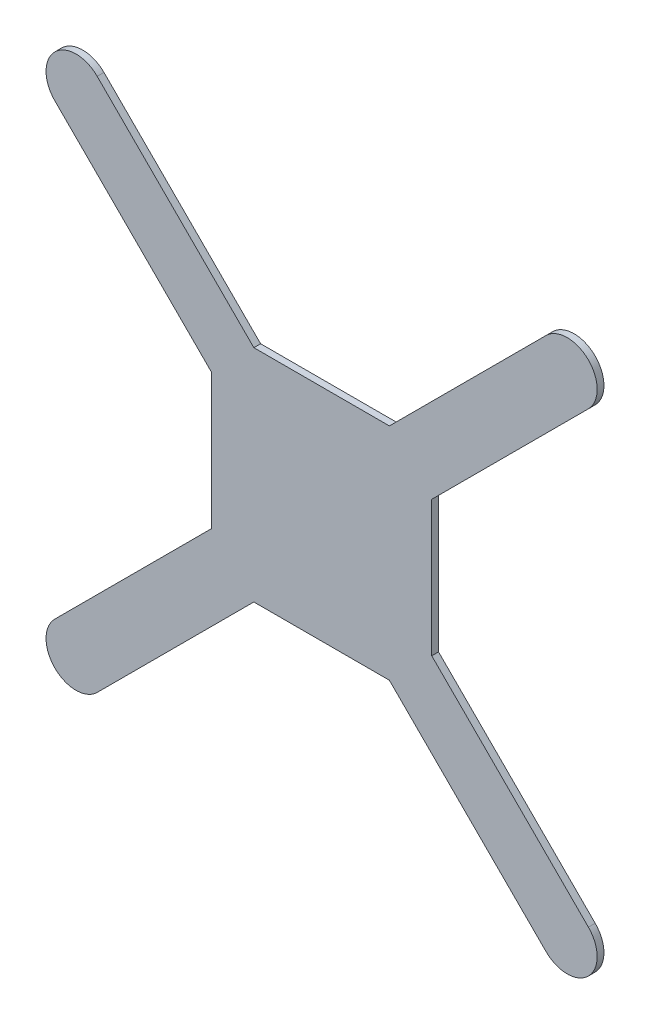
ISO-10303-21;
HEADER;
FILE_DESCRIPTION(('STEP AP214'),'2;1');
FILE_NAME('part.step','',(''),(''),'','','');
FILE_SCHEMA(('AUTOMOTIVE_DESIGN { 1 0 10303 214 1 1 1 1 }'));
ENDSEC;
DATA;
#1=APPLICATION_CONTEXT('core data for automotive mechanical design processes');
#2=APPLICATION_PROTOCOL_DEFINITION('international standard','automotive_design',2000,#1);
#3=PRODUCT_CONTEXT('',#1,'mechanical');
#4=PRODUCT('Part','Part','',(#3));
#5=PRODUCT_RELATED_PRODUCT_CATEGORY('part','',(#4));
#6=PRODUCT_DEFINITION_FORMATION('','',#4);
#7=PRODUCT_DEFINITION_CONTEXT('part definition',#1,'design');
#8=PRODUCT_DEFINITION('design','',#6,#7);
#9=PRODUCT_DEFINITION_SHAPE('','',#8);
#10=(LENGTH_UNIT() NAMED_UNIT(*) SI_UNIT(.MILLI.,.METRE.));
#11=(NAMED_UNIT(*) PLANE_ANGLE_UNIT() SI_UNIT($,.RADIAN.));
#12=(NAMED_UNIT(*) SI_UNIT($,.STERADIAN.) SOLID_ANGLE_UNIT());
#13=UNCERTAINTY_MEASURE_WITH_UNIT(LENGTH_MEASURE(1.E-05),#10,'distance_accuracy_value','');
#14=(GEOMETRIC_REPRESENTATION_CONTEXT(3) GLOBAL_UNCERTAINTY_ASSIGNED_CONTEXT((#13)) GLOBAL_UNIT_ASSIGNED_CONTEXT((#10,
#11,#12)) REPRESENTATION_CONTEXT('',''));
#15=CARTESIAN_POINT('',(0.,0.,0.));
#16=DIRECTION('',(0.,0.,1.));
#17=DIRECTION('',(1.,0.,0.));
#18=AXIS2_PLACEMENT_3D('',#15,#16,#17);
#19=CARTESIAN_POINT('',(-144.956890143243,-144.956890143242,4.));
#20=DIRECTION('',(0.,0.,-1.));
#21=DIRECTION('',(-1.,0.,0.));
#22=AXIS2_PLACEMENT_3D('',#19,#20,#21);
#23=CYLINDRICAL_SURFACE('',#22,17.6776695296638);
#24=CARTESIAN_POINT('',(-144.956890143243,-144.956890143242,0.));
#25=DIRECTION('',(0.,0.,1.));
#26=DIRECTION('',(1.,0.,0.));
#27=AXIS2_PLACEMENT_3D('',#24,#25,#26);
#28=CIRCLE('',#27,17.6776695296638);
#29=CARTESIAN_POINT('',(-132.456890143243,-157.456890143242,0.));
#30=VERTEX_POINT('',#29);
#31=CARTESIAN_POINT('',(-157.456890143243,-132.456890143242,0.));
#32=VERTEX_POINT('',#31);
#33=EDGE_CURVE('E182',#30,#32,#28,.F.);
#34=ORIENTED_EDGE('',*,*,#33,.F.);
#35=DIRECTION('',(0.,0.,-1.));
#36=VECTOR('',#35,1.);
#37=CARTESIAN_POINT('',(-132.456890143243,-157.456890143242,4.));
#38=LINE('',#37,#36);
#39=CARTESIAN_POINT('',(-132.456890143243,-157.456890143242,4.));
#40=VERTEX_POINT('',#39);
#41=EDGE_CURVE('E11',#40,#30,#38,.T.);
#42=ORIENTED_EDGE('',*,*,#41,.F.);
#43=CARTESIAN_POINT('',(-144.956890143243,-144.956890143242,4.));
#44=DIRECTION('',(0.,0.,1.));
#45=DIRECTION('',(1.,0.,0.));
#46=AXIS2_PLACEMENT_3D('',#43,#44,#45);
#47=CIRCLE('',#46,17.6776695296638);
#48=CARTESIAN_POINT('',(-157.456890143243,-132.456890143242,4.));
#49=VERTEX_POINT('',#48);
#50=EDGE_CURVE('E222',#40,#49,#47,.F.);
#51=ORIENTED_EDGE('',*,*,#50,.T.);
#52=DIRECTION('',(0.,0.,-1.));
#53=VECTOR('',#52,1.);
#54=CARTESIAN_POINT('',(-157.456890143243,-132.456890143242,4.));
#55=LINE('',#54,#53);
#56=EDGE_CURVE('E115',#49,#32,#55,.T.);
#57=ORIENTED_EDGE('',*,*,#56,.T.);
#58=EDGE_LOOP('',(#34,#42,#51,#57));
#59=FACE_BOUND('',#58,.T.);
#60=ADVANCED_FACE('F41',(#59),#23,.T.);
#61=CARTESIAN_POINT('',(12.5000000000001,-12.5000000000002,4.));
#62=DIRECTION('',(0.707106781186545,-0.70710678118655,0.));
#63=DIRECTION('',(0.70710678118655,0.707106781186545,0.));
#64=AXIS2_PLACEMENT_3D('',#61,#62,#63);
#65=PLANE('',#64);
#66=DIRECTION('',(-0.70710678118655,-0.707106781186545,0.));
#67=VECTOR('',#66,1.);
#68=CARTESIAN_POINT('',(12.5000000000001,-12.5000000000002,0.));
#69=LINE('',#68,#67);
#70=CARTESIAN_POINT('',(-40.,-64.9999999999999,0.));
#71=VERTEX_POINT('',#70);
#72=EDGE_CURVE('E185',#71,#30,#69,.T.);
#73=ORIENTED_EDGE('',*,*,#72,.F.);
#74=DIRECTION('',(0.,0.,-1.));
#75=VECTOR('',#74,1.);
#76=CARTESIAN_POINT('',(-40.,-64.9999999999999,4.));
#77=LINE('',#76,#75);
#78=CARTESIAN_POINT('',(-40.,-64.9999999999999,4.));
#79=VERTEX_POINT('',#78);
#80=EDGE_CURVE('E49',#79,#71,#77,.T.);
#81=ORIENTED_EDGE('',*,*,#80,.F.);
#82=DIRECTION('',(-0.70710678118655,-0.707106781186545,0.));
#83=VECTOR('',#82,1.);
#84=CARTESIAN_POINT('',(12.5000000000001,-12.5000000000002,4.));
#85=LINE('',#84,#83);
#86=EDGE_CURVE('E263',#79,#40,#85,.T.);
#87=ORIENTED_EDGE('',*,*,#86,.T.);
#88=ORIENTED_EDGE('',*,*,#41,.T.);
#89=EDGE_LOOP('',(#73,#81,#87,#88));
#90=FACE_BOUND('',#89,.T.);
#91=ADVANCED_FACE('F262',(#90),#65,.T.);
#92=CARTESIAN_POINT('',(0.,-64.9999999999999,4.));
#93=DIRECTION('',(0.,1.,0.));
#94=DIRECTION('',(-1.,0.,0.));
#95=AXIS2_PLACEMENT_3D('',#92,#93,#94);
#96=PLANE('',#95);
#97=DIRECTION('',(1.,0.,0.));
#98=VECTOR('',#97,1.);
#99=CARTESIAN_POINT('',(0.,-64.9999999999999,0.));
#100=LINE('',#99,#98);
#101=CARTESIAN_POINT('',(39.9999999999999,-64.9999999999999,0.));
#102=VERTEX_POINT('',#101);
#103=EDGE_CURVE('E188',#71,#102,#100,.T.);
#104=ORIENTED_EDGE('',*,*,#103,.T.);
#105=DIRECTION('',(0.,0.,-1.));
#106=VECTOR('',#105,1.);
#107=CARTESIAN_POINT('',(39.9999999999999,-64.9999999999999,4.));
#108=LINE('',#107,#106);
#109=CARTESIAN_POINT('',(39.9999999999999,-64.9999999999999,4.));
#110=VERTEX_POINT('',#109);
#111=EDGE_CURVE('E246',#110,#102,#108,.T.);
#112=ORIENTED_EDGE('',*,*,#111,.F.);
#113=DIRECTION('',(1.,0.,0.));
#114=VECTOR('',#113,1.);
#115=CARTESIAN_POINT('',(0.,-64.9999999999999,4.));
#116=LINE('',#115,#114);
#117=EDGE_CURVE('E253',#79,#110,#116,.T.);
#118=ORIENTED_EDGE('',*,*,#117,.F.);
#119=ORIENTED_EDGE('',*,*,#80,.T.);
#120=EDGE_LOOP('',(#104,#112,#118,#119));
#121=FACE_BOUND('',#120,.T.);
#122=ADVANCED_FACE('F251',(#121),#96,.F.);
#123=CARTESIAN_POINT('',(-12.5000000000002,-12.5000000000003,4.));
#124=DIRECTION('',(0.707106781186544,0.707106781186551,0.));
#125=DIRECTION('',(-0.707106781186551,0.707106781186544,0.));
#126=AXIS2_PLACEMENT_3D('',#123,#124,#125);
#127=PLANE('',#126);
#128=DIRECTION('',(0.707106781186551,-0.707106781186544,0.));
#129=VECTOR('',#128,1.);
#130=CARTESIAN_POINT('',(-12.5000000000002,-12.5000000000003,0.));
#131=LINE('',#130,#129);
#132=CARTESIAN_POINT('',(132.456890143243,-157.456890143242,0.));
#133=VERTEX_POINT('',#132);
#134=EDGE_CURVE('E190',#102,#133,#131,.T.);
#135=ORIENTED_EDGE('',*,*,#134,.T.);
#136=DIRECTION('',(0.,0.,-1.));
#137=VECTOR('',#136,1.);
#138=CARTESIAN_POINT('',(132.456890143243,-157.456890143242,4.));
#139=LINE('',#138,#137);
#140=CARTESIAN_POINT('',(132.456890143243,-157.456890143242,4.));
#141=VERTEX_POINT('',#140);
#142=EDGE_CURVE('E243',#141,#133,#139,.T.);
#143=ORIENTED_EDGE('',*,*,#142,.F.);
#144=DIRECTION('',(0.707106781186551,-0.707106781186544,0.));
#145=VECTOR('',#144,1.);
#146=CARTESIAN_POINT('',(-12.5000000000002,-12.5000000000003,4.));
#147=LINE('',#146,#145);
#148=EDGE_CURVE('E271',#110,#141,#147,.T.);
#149=ORIENTED_EDGE('',*,*,#148,.F.);
#150=ORIENTED_EDGE('',*,*,#111,.T.);
#151=EDGE_LOOP('',(#135,#143,#149,#150));
#152=FACE_BOUND('',#151,.T.);
#153=ADVANCED_FACE('F331',(#152),#127,.F.);
#154=CARTESIAN_POINT('',(144.956890143243,-144.956890143242,4.));
#155=DIRECTION('',(0.,0.,-1.));
#156=DIRECTION('',(-1.,0.,0.));
#157=AXIS2_PLACEMENT_3D('',#154,#155,#156);
#158=CYLINDRICAL_SURFACE('',#157,17.6776695296637);
#159=CARTESIAN_POINT('',(144.956890143243,-144.956890143242,0.));
#160=DIRECTION('',(0.,0.,1.));
#161=DIRECTION('',(1.,0.,0.));
#162=AXIS2_PLACEMENT_3D('',#159,#160,#161);
#163=CIRCLE('',#162,17.6776695296637);
#164=CARTESIAN_POINT('',(157.456890143243,-132.456890143242,0.));
#165=VERTEX_POINT('',#164);
#166=EDGE_CURVE('E192',#133,#165,#163,.T.);
#167=ORIENTED_EDGE('',*,*,#166,.T.);
#168=DIRECTION('',(0.,0.,-1.));
#169=VECTOR('',#168,1.);
#170=CARTESIAN_POINT('',(157.456890143243,-132.456890143242,4.));
#171=LINE('',#170,#169);
#172=CARTESIAN_POINT('',(157.456890143243,-132.456890143242,4.));
#173=VERTEX_POINT('',#172);
#174=EDGE_CURVE('E241',#173,#165,#171,.T.);
#175=ORIENTED_EDGE('',*,*,#174,.F.);
#176=CARTESIAN_POINT('',(144.956890143243,-144.956890143242,4.));
#177=DIRECTION('',(0.,0.,1.));
#178=DIRECTION('',(1.,0.,0.));
#179=AXIS2_PLACEMENT_3D('',#176,#177,#178);
#180=CIRCLE('',#179,17.6776695296637);
#181=EDGE_CURVE('E273',#141,#173,#180,.T.);
#182=ORIENTED_EDGE('',*,*,#181,.F.);
#183=ORIENTED_EDGE('',*,*,#142,.T.);
#184=EDGE_LOOP('',(#167,#175,#182,#183));
#185=FACE_BOUND('',#184,.T.);
#186=ADVANCED_FACE('F327',(#185),#158,.T.);
#187=CARTESIAN_POINT('',(12.4999999999998,12.4999999999999,4.));
#188=DIRECTION('',(0.707106781186544,0.707106781186551,0.));
#189=DIRECTION('',(-0.707106781186551,0.707106781186544,0.));
#190=AXIS2_PLACEMENT_3D('',#187,#188,#189);
#191=PLANE('',#190);
#192=DIRECTION('',(0.707106781186551,-0.707106781186544,0.));
#193=VECTOR('',#192,1.);
#194=CARTESIAN_POINT('',(12.4999999999998,12.4999999999999,0.));
#195=LINE('',#194,#193);
#196=CARTESIAN_POINT('',(65.,-39.9999999999999,0.));
#197=VERTEX_POINT('',#196);
#198=EDGE_CURVE('E195',#197,#165,#195,.T.);
#199=ORIENTED_EDGE('',*,*,#198,.F.);
#200=DIRECTION('',(0.,0.,-1.));
#201=VECTOR('',#200,1.);
#202=CARTESIAN_POINT('',(65.,-39.9999999999999,4.));
#203=LINE('',#202,#201);
#204=CARTESIAN_POINT('',(65.,-39.9999999999999,4.));
#205=VERTEX_POINT('',#204);
#206=EDGE_CURVE('E239',#205,#197,#203,.T.);
#207=ORIENTED_EDGE('',*,*,#206,.F.);
#208=DIRECTION('',(0.707106781186551,-0.707106781186544,0.));
#209=VECTOR('',#208,1.);
#210=CARTESIAN_POINT('',(12.4999999999998,12.4999999999999,4.));
#211=LINE('',#210,#209);
#212=EDGE_CURVE('E275',#205,#173,#211,.T.);
#213=ORIENTED_EDGE('',*,*,#212,.T.);
#214=ORIENTED_EDGE('',*,*,#174,.T.);
#215=EDGE_LOOP('',(#199,#207,#213,#214));
#216=FACE_BOUND('',#215,.T.);
#217=ADVANCED_FACE('F322',(#216),#191,.T.);
#218=CARTESIAN_POINT('',(65.,0.,4.));
#219=DIRECTION('',(1.,0.,0.));
#220=DIRECTION('',(0.,1.,0.));
#221=AXIS2_PLACEMENT_3D('',#218,#219,#220);
#222=PLANE('',#221);
#223=DIRECTION('',(0.,-1.,0.));
#224=VECTOR('',#223,1.);
#225=CARTESIAN_POINT('',(65.,0.,0.));
#226=LINE('',#225,#224);
#227=CARTESIAN_POINT('',(65.,40.,0.));
#228=VERTEX_POINT('',#227);
#229=EDGE_CURVE('E198',#228,#197,#226,.T.);
#230=ORIENTED_EDGE('',*,*,#229,.F.);
#231=DIRECTION('',(0.,0.,-1.));
#232=VECTOR('',#231,1.);
#233=CARTESIAN_POINT('',(65.,40.,4.));
#234=LINE('',#233,#232);
#235=CARTESIAN_POINT('',(65.,40.,4.));
#236=VERTEX_POINT('',#235);
#237=EDGE_CURVE('E237',#236,#228,#234,.T.);
#238=ORIENTED_EDGE('',*,*,#237,.F.);
#239=DIRECTION('',(0.,-1.,0.));
#240=VECTOR('',#239,1.);
#241=CARTESIAN_POINT('',(65.,0.,4.));
#242=LINE('',#241,#240);
#243=EDGE_CURVE('E278',#236,#205,#242,.T.);
#244=ORIENTED_EDGE('',*,*,#243,.T.);
#245=ORIENTED_EDGE('',*,*,#206,.T.);
#246=EDGE_LOOP('',(#230,#238,#244,#245));
#247=FACE_BOUND('',#246,.T.);
#248=ADVANCED_FACE('F319',(#247),#222,.T.);
#249=CARTESIAN_POINT('',(12.4999999999996,-12.4999999999998,4.));
#250=DIRECTION('',(-0.707106781186544,0.707106781186551,0.));
#251=DIRECTION('',(-0.707106781186551,-0.707106781186544,0.));
#252=AXIS2_PLACEMENT_3D('',#249,#250,#251);
#253=PLANE('',#252);
#254=DIRECTION('',(0.707106781186551,0.707106781186544,0.));
#255=VECTOR('',#254,1.);
#256=CARTESIAN_POINT('',(12.4999999999996,-12.4999999999998,0.));
#257=LINE('',#256,#255);
#258=CARTESIAN_POINT('',(157.456890143243,132.456890143242,0.));
#259=VERTEX_POINT('',#258);
#260=EDGE_CURVE('E201',#228,#259,#257,.T.);
#261=ORIENTED_EDGE('',*,*,#260,.T.);
#262=DIRECTION('',(0.,0.,-1.));
#263=VECTOR('',#262,1.);
#264=CARTESIAN_POINT('',(157.456890143243,132.456890143242,4.));
#265=LINE('',#264,#263);
#266=CARTESIAN_POINT('',(157.456890143243,132.456890143242,4.));
#267=VERTEX_POINT('',#266);
#268=EDGE_CURVE('E235',#267,#259,#265,.T.);
#269=ORIENTED_EDGE('',*,*,#268,.F.);
#270=DIRECTION('',(0.707106781186551,0.707106781186544,0.));
#271=VECTOR('',#270,1.);
#272=CARTESIAN_POINT('',(12.4999999999996,-12.4999999999998,4.));
#273=LINE('',#272,#271);
#274=EDGE_CURVE('E281',#236,#267,#273,.T.);
#275=ORIENTED_EDGE('',*,*,#274,.F.);
#276=ORIENTED_EDGE('',*,*,#237,.T.);
#277=EDGE_LOOP('',(#261,#269,#275,#276));
#278=FACE_BOUND('',#277,.T.);
#279=ADVANCED_FACE('F316',(#278),#253,.F.);
#280=CARTESIAN_POINT('',(144.956890143243,144.956890143242,4.));
#281=DIRECTION('',(0.,0.,-1.));
#282=DIRECTION('',(-1.,0.,0.));
#283=AXIS2_PLACEMENT_3D('',#280,#281,#282);
#284=CYLINDRICAL_SURFACE('',#283,17.6776695296637);
#285=CARTESIAN_POINT('',(144.956890143243,144.956890143242,0.));
#286=DIRECTION('',(0.,0.,1.));
#287=DIRECTION('',(1.,0.,0.));
#288=AXIS2_PLACEMENT_3D('',#285,#286,#287);
#289=CIRCLE('',#288,17.6776695296637);
#290=CARTESIAN_POINT('',(132.456890143243,157.456890143242,0.));
#291=VERTEX_POINT('',#290);
#292=EDGE_CURVE('E204',#291,#259,#289,.F.);
#293=ORIENTED_EDGE('',*,*,#292,.F.);
#294=DIRECTION('',(0.,0.,-1.));
#295=VECTOR('',#294,1.);
#296=CARTESIAN_POINT('',(132.456890143243,157.456890143242,4.));
#297=LINE('',#296,#295);
#298=CARTESIAN_POINT('',(132.456890143243,157.456890143242,4.));
#299=VERTEX_POINT('',#298);
#300=EDGE_CURVE('E233',#299,#291,#297,.T.);
#301=ORIENTED_EDGE('',*,*,#300,.F.);
#302=CARTESIAN_POINT('',(144.956890143243,144.956890143242,4.));
#303=DIRECTION('',(0.,0.,1.));
#304=DIRECTION('',(1.,0.,0.));
#305=AXIS2_PLACEMENT_3D('',#302,#303,#304);
#306=CIRCLE('',#305,17.6776695296637);
#307=EDGE_CURVE('E283',#299,#267,#306,.F.);
#308=ORIENTED_EDGE('',*,*,#307,.T.);
#309=ORIENTED_EDGE('',*,*,#268,.T.);
#310=EDGE_LOOP('',(#293,#301,#308,#309));
#311=FACE_BOUND('',#310,.T.);
#312=ADVANCED_FACE('F311',(#311),#284,.T.);
#313=CARTESIAN_POINT('',(-12.5000000000002,12.5000000000004,4.));
#314=DIRECTION('',(-0.707106781186544,0.707106781186551,0.));
#315=DIRECTION('',(-0.707106781186551,-0.707106781186544,0.));
#316=AXIS2_PLACEMENT_3D('',#313,#314,#315);
#317=PLANE('',#316);
#318=DIRECTION('',(0.707106781186551,0.707106781186544,0.));
#319=VECTOR('',#318,1.);
#320=CARTESIAN_POINT('',(-12.5000000000002,12.5000000000004,0.));
#321=LINE('',#320,#319);
#322=CARTESIAN_POINT('',(40.,65.,0.));
#323=VERTEX_POINT('',#322);
#324=EDGE_CURVE('E207',#323,#291,#321,.T.);
#325=ORIENTED_EDGE('',*,*,#324,.F.);
#326=DIRECTION('',(0.,0.,-1.));
#327=VECTOR('',#326,1.);
#328=CARTESIAN_POINT('',(40.,65.,4.));
#329=LINE('',#328,#327);
#330=CARTESIAN_POINT('',(40.,65.,4.));
#331=VERTEX_POINT('',#330);
#332=EDGE_CURVE('E231',#331,#323,#329,.T.);
#333=ORIENTED_EDGE('',*,*,#332,.F.);
#334=DIRECTION('',(0.707106781186551,0.707106781186544,0.));
#335=VECTOR('',#334,1.);
#336=CARTESIAN_POINT('',(-12.5000000000002,12.5000000000004,4.));
#337=LINE('',#336,#335);
#338=EDGE_CURVE('E286',#331,#299,#337,.T.);
#339=ORIENTED_EDGE('',*,*,#338,.T.);
#340=ORIENTED_EDGE('',*,*,#300,.T.);
#341=EDGE_LOOP('',(#325,#333,#339,#340));
#342=FACE_BOUND('',#341,.T.);
#343=ADVANCED_FACE('F306',(#342),#317,.T.);
#344=CARTESIAN_POINT('',(0.,65.,4.));
#345=DIRECTION('',(0.,1.,0.));
#346=DIRECTION('',(-1.,0.,0.));
#347=AXIS2_PLACEMENT_3D('',#344,#345,#346);
#348=PLANE('',#347);
#349=DIRECTION('',(1.,0.,0.));
#350=VECTOR('',#349,1.);
#351=CARTESIAN_POINT('',(0.,65.,0.));
#352=LINE('',#351,#350);
#353=CARTESIAN_POINT('',(-40.,65.,0.));
#354=VERTEX_POINT('',#353);
#355=EDGE_CURVE('E210',#354,#323,#352,.T.);
#356=ORIENTED_EDGE('',*,*,#355,.F.);
#357=DIRECTION('',(0.,0.,-1.));
#358=VECTOR('',#357,1.);
#359=CARTESIAN_POINT('',(-40.,65.,4.));
#360=LINE('',#359,#358);
#361=CARTESIAN_POINT('',(-40.,65.,4.));
#362=VERTEX_POINT('',#361);
#363=EDGE_CURVE('E229',#362,#354,#360,.T.);
#364=ORIENTED_EDGE('',*,*,#363,.F.);
#365=DIRECTION('',(1.,0.,0.));
#366=VECTOR('',#365,1.);
#367=CARTESIAN_POINT('',(0.,65.,4.));
#368=LINE('',#367,#366);
#369=EDGE_CURVE('E289',#362,#331,#368,.T.);
#370=ORIENTED_EDGE('',*,*,#369,.T.);
#371=ORIENTED_EDGE('',*,*,#332,.T.);
#372=EDGE_LOOP('',(#356,#364,#370,#371));
#373=FACE_BOUND('',#372,.T.);
#374=ADVANCED_FACE('F303',(#373),#348,.T.);
#375=CARTESIAN_POINT('',(12.5000000000002,12.5000000000003,4.));
#376=DIRECTION('',(-0.707106781186545,-0.707106781186551,0.));
#377=DIRECTION('',(0.707106781186551,-0.707106781186545,0.));
#378=AXIS2_PLACEMENT_3D('',#375,#376,#377);
#379=PLANE('',#378);
#380=DIRECTION('',(-0.707106781186551,0.707106781186545,0.));
#381=VECTOR('',#380,1.);
#382=CARTESIAN_POINT('',(12.5000000000002,12.5000000000003,0.));
#383=LINE('',#382,#381);
#384=CARTESIAN_POINT('',(-132.456890143243,157.456890143242,0.));
#385=VERTEX_POINT('',#384);
#386=EDGE_CURVE('E213',#354,#385,#383,.T.);
#387=ORIENTED_EDGE('',*,*,#386,.T.);
#388=DIRECTION('',(0.,0.,-1.));
#389=VECTOR('',#388,1.);
#390=CARTESIAN_POINT('',(-132.456890143243,157.456890143242,4.));
#391=LINE('',#390,#389);
#392=CARTESIAN_POINT('',(-132.456890143243,157.456890143242,4.));
#393=VERTEX_POINT('',#392);
#394=EDGE_CURVE('E226',#393,#385,#391,.T.);
#395=ORIENTED_EDGE('',*,*,#394,.F.);
#396=DIRECTION('',(-0.707106781186551,0.707106781186545,0.));
#397=VECTOR('',#396,1.);
#398=CARTESIAN_POINT('',(12.5000000000002,12.5000000000003,4.));
#399=LINE('',#398,#397);
#400=EDGE_CURVE('E177',#362,#393,#399,.T.);
#401=ORIENTED_EDGE('',*,*,#400,.F.);
#402=ORIENTED_EDGE('',*,*,#363,.T.);
#403=EDGE_LOOP('',(#387,#395,#401,#402));
#404=FACE_BOUND('',#403,.T.);
#405=ADVANCED_FACE('F296',(#404),#379,.F.);
#406=CARTESIAN_POINT('',(-144.956890143243,144.956890143242,4.));
#407=DIRECTION('',(0.,0.,-1.));
#408=DIRECTION('',(-1.,0.,0.));
#409=AXIS2_PLACEMENT_3D('',#406,#407,#408);
#410=CYLINDRICAL_SURFACE('',#409,17.6776695296638);
#411=CARTESIAN_POINT('',(-144.956890143243,144.956890143242,0.));
#412=DIRECTION('',(0.,0.,1.));
#413=DIRECTION('',(1.,0.,0.));
#414=AXIS2_PLACEMENT_3D('',#411,#412,#413);
#415=CIRCLE('',#414,17.6776695296638);
#416=CARTESIAN_POINT('',(-157.456890143243,132.456890143242,0.));
#417=VERTEX_POINT('',#416);
#418=EDGE_CURVE('E215',#385,#417,#415,.T.);
#419=ORIENTED_EDGE('',*,*,#418,.T.);
#420=DIRECTION('',(0.,0.,-1.));
#421=VECTOR('',#420,1.);
#422=CARTESIAN_POINT('',(-157.456890143243,132.456890143242,4.));
#423=LINE('',#422,#421);
#424=CARTESIAN_POINT('',(-157.456890143243,132.456890143242,4.));
#425=VERTEX_POINT('',#424);
#426=EDGE_CURVE('E166',#425,#417,#423,.T.);
#427=ORIENTED_EDGE('',*,*,#426,.F.);
#428=CARTESIAN_POINT('',(-144.956890143243,144.956890143242,4.));
#429=DIRECTION('',(0.,0.,1.));
#430=DIRECTION('',(1.,0.,0.));
#431=AXIS2_PLACEMENT_3D('',#428,#429,#430);
#432=CIRCLE('',#431,17.6776695296638);
#433=EDGE_CURVE('E174',#393,#425,#432,.T.);
#434=ORIENTED_EDGE('',*,*,#433,.F.);
#435=ORIENTED_EDGE('',*,*,#394,.T.);
#436=EDGE_LOOP('',(#419,#427,#434,#435));
#437=FACE_BOUND('',#436,.T.);
#438=ADVANCED_FACE('F300',(#437),#410,.T.);
#439=CARTESIAN_POINT('',(-12.4999999999997,-12.4999999999998,4.));
#440=DIRECTION('',(-0.707106781186544,-0.707106781186552,0.));
#441=DIRECTION('',(0.707106781186551,-0.707106781186544,0.));
#442=AXIS2_PLACEMENT_3D('',#439,#440,#441);
#443=PLANE('',#442);
#444=DIRECTION('',(-0.707106781186551,0.707106781186544,0.));
#445=VECTOR('',#444,1.);
#446=CARTESIAN_POINT('',(-12.4999999999997,-12.4999999999998,0.));
#447=LINE('',#446,#445);
#448=CARTESIAN_POINT('',(-65.,40.,0.));
#449=VERTEX_POINT('',#448);
#450=EDGE_CURVE('E165',#449,#417,#447,.T.);
#451=ORIENTED_EDGE('',*,*,#450,.F.);
#452=DIRECTION('',(0.,0.,-1.));
#453=VECTOR('',#452,1.);
#454=CARTESIAN_POINT('',(-65.,40.,4.));
#455=LINE('',#454,#453);
#456=CARTESIAN_POINT('',(-65.,40.,4.));
#457=VERTEX_POINT('',#456);
#458=EDGE_CURVE('E159',#457,#449,#455,.T.);
#459=ORIENTED_EDGE('',*,*,#458,.F.);
#460=DIRECTION('',(-0.707106781186551,0.707106781186544,0.));
#461=VECTOR('',#460,1.);
#462=CARTESIAN_POINT('',(-12.4999999999997,-12.4999999999998,4.));
#463=LINE('',#462,#461);
#464=EDGE_CURVE('E163',#457,#425,#463,.T.);
#465=ORIENTED_EDGE('',*,*,#464,.T.);
#466=ORIENTED_EDGE('',*,*,#426,.T.);
#467=EDGE_LOOP('',(#451,#459,#465,#466));
#468=FACE_BOUND('',#467,.T.);
#469=ADVANCED_FACE('F161',(#468),#443,.T.);
#470=CARTESIAN_POINT('',(-65.,0.,4.));
#471=DIRECTION('',(1.,0.,0.));
#472=DIRECTION('',(0.,0.,-1.));
#473=AXIS2_PLACEMENT_3D('',#470,#471,#472);
#474=PLANE('',#473);
#475=DIRECTION('',(0.,-1.,0.));
#476=VECTOR('',#475,1.);
#477=CARTESIAN_POINT('',(-65.,0.,0.));
#478=LINE('',#477,#476);
#479=CARTESIAN_POINT('',(-65.,-40.,0.));
#480=VERTEX_POINT('',#479);
#481=EDGE_CURVE('E108',#449,#480,#478,.T.);
#482=ORIENTED_EDGE('',*,*,#481,.T.);
#483=DIRECTION('',(0.,0.,-1.));
#484=VECTOR('',#483,1.);
#485=CARTESIAN_POINT('',(-65.,-40.,4.));
#486=LINE('',#485,#484);
#487=CARTESIAN_POINT('',(-65.,-40.,4.));
#488=VERTEX_POINT('',#487);
#489=EDGE_CURVE('E167',#488,#480,#486,.T.);
#490=ORIENTED_EDGE('',*,*,#489,.F.);
#491=DIRECTION('',(0.,-1.,0.));
#492=VECTOR('',#491,1.);
#493=CARTESIAN_POINT('',(-65.,0.,4.));
#494=LINE('',#493,#492);
#495=EDGE_CURVE('E169',#457,#488,#494,.T.);
#496=ORIENTED_EDGE('',*,*,#495,.F.);
#497=ORIENTED_EDGE('',*,*,#458,.T.);
#498=EDGE_LOOP('',(#482,#490,#496,#497));
#499=FACE_BOUND('',#498,.T.);
#500=ADVANCED_FACE('F170',(#499),#474,.F.);
#501=CARTESIAN_POINT('',(-12.4999999999996,12.4999999999998,4.));
#502=DIRECTION('',(0.707106781186544,-0.707106781186552,0.));
#503=DIRECTION('',(0.707106781186551,0.707106781186544,0.));
#504=AXIS2_PLACEMENT_3D('',#501,#502,#503);
#505=PLANE('',#504);
#506=DIRECTION('',(-0.707106781186551,-0.707106781186544,0.));
#507=VECTOR('',#506,1.);
#508=CARTESIAN_POINT('',(-12.4999999999996,12.4999999999998,0.));
#509=LINE('',#508,#507);
#510=EDGE_CURVE('E220',#480,#32,#509,.T.);
#511=ORIENTED_EDGE('',*,*,#510,.T.);
#512=ORIENTED_EDGE('',*,*,#56,.F.);
#513=DIRECTION('',(-0.707106781186551,-0.707106781186544,0.));
#514=VECTOR('',#513,1.);
#515=CARTESIAN_POINT('',(-12.4999999999996,12.4999999999998,4.));
#516=LINE('',#515,#514);
#517=EDGE_CURVE('E57',#488,#49,#516,.T.);
#518=ORIENTED_EDGE('',*,*,#517,.F.);
#519=ORIENTED_EDGE('',*,*,#489,.T.);
#520=EDGE_LOOP('',(#511,#512,#518,#519));
#521=FACE_BOUND('',#520,.T.);
#522=ADVANCED_FACE('F266',(#521),#505,.F.);
#523=CARTESIAN_POINT('',(0.,0.,4.));
#524=DIRECTION('',(0.,0.,1.));
#525=DIRECTION('',(1.,0.,0.));
#526=AXIS2_PLACEMENT_3D('',#523,#524,#525);
#527=PLANE('',#526);
#528=ORIENTED_EDGE('',*,*,#50,.F.);
#529=ORIENTED_EDGE('',*,*,#86,.F.);
#530=ORIENTED_EDGE('',*,*,#117,.T.);
#531=ORIENTED_EDGE('',*,*,#148,.T.);
#532=ORIENTED_EDGE('',*,*,#181,.T.);
#533=ORIENTED_EDGE('',*,*,#212,.F.);
#534=ORIENTED_EDGE('',*,*,#243,.F.);
#535=ORIENTED_EDGE('',*,*,#274,.T.);
#536=ORIENTED_EDGE('',*,*,#307,.F.);
#537=ORIENTED_EDGE('',*,*,#338,.F.);
#538=ORIENTED_EDGE('',*,*,#369,.F.);
#539=ORIENTED_EDGE('',*,*,#400,.T.);
#540=ORIENTED_EDGE('',*,*,#433,.T.);
#541=ORIENTED_EDGE('',*,*,#464,.F.);
#542=ORIENTED_EDGE('',*,*,#495,.T.);
#543=ORIENTED_EDGE('',*,*,#517,.T.);
#544=EDGE_LOOP('',(#528,#529,#530,#531,#532,#533,#534,#535,#536,#537,#538,#539,#540,#541,#542,#543));
#545=FACE_BOUND('',#544,.T.);
#546=ADVANCED_FACE('F172',(#545),#527,.T.);
#547=CARTESIAN_POINT('',(0.,0.,0.));
#548=DIRECTION('',(0.,0.,1.));
#549=DIRECTION('',(1.,0.,0.));
#550=AXIS2_PLACEMENT_3D('',#547,#548,#549);
#551=PLANE('',#550);
#552=ORIENTED_EDGE('',*,*,#33,.T.);
#553=ORIENTED_EDGE('',*,*,#510,.F.);
#554=ORIENTED_EDGE('',*,*,#481,.F.);
#555=ORIENTED_EDGE('',*,*,#450,.T.);
#556=ORIENTED_EDGE('',*,*,#418,.F.);
#557=ORIENTED_EDGE('',*,*,#386,.F.);
#558=ORIENTED_EDGE('',*,*,#355,.T.);
#559=ORIENTED_EDGE('',*,*,#324,.T.);
#560=ORIENTED_EDGE('',*,*,#292,.T.);
#561=ORIENTED_EDGE('',*,*,#260,.F.);
#562=ORIENTED_EDGE('',*,*,#229,.T.);
#563=ORIENTED_EDGE('',*,*,#198,.T.);
#564=ORIENTED_EDGE('',*,*,#166,.F.);
#565=ORIENTED_EDGE('',*,*,#134,.F.);
#566=ORIENTED_EDGE('',*,*,#103,.F.);
#567=ORIENTED_EDGE('',*,*,#72,.T.);
#568=EDGE_LOOP('',(#552,#553,#554,#555,#556,#557,#558,#559,#560,#561,#562,#563,#564,#565,#566,#567));
#569=FACE_BOUND('',#568,.T.);
#570=ADVANCED_FACE('F260',(#569),#551,.F.);
#571=CLOSED_SHELL('',(#60,#91,#122,#153,#186,#217,#248,#279,#312,#343,#374,#405,#438,#469,#500,
#522,#546,#570));
#572=MANIFOLD_SOLID_BREP('B2',#571);
#573=ADVANCED_BREP_SHAPE_REPRESENTATION('',(#18,#572),#14);
#574=SHAPE_DEFINITION_REPRESENTATION(#9,#573);
ENDSEC;
END-ISO-10303-21;
